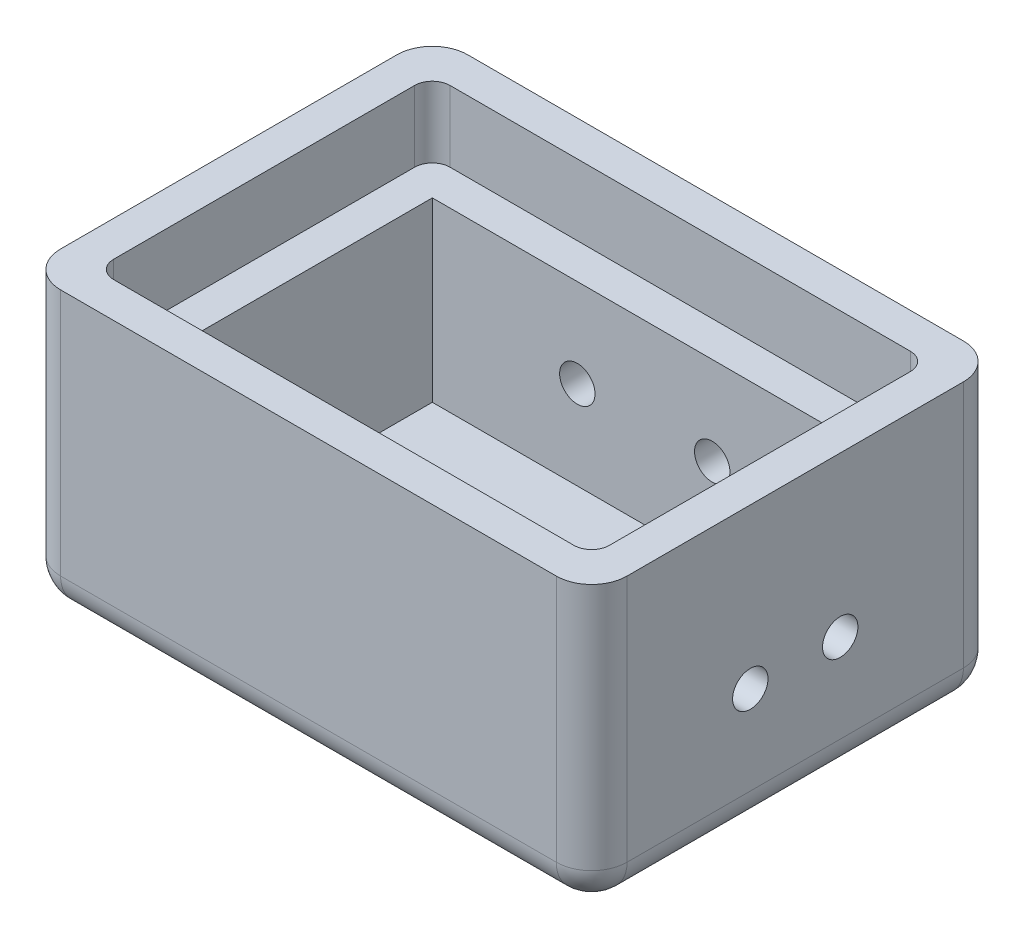
ISO-10303-21;
HEADER;
FILE_DESCRIPTION(('STEP AP214'),'2;1');
FILE_NAME('part.step','',(''),(''),'','','');
FILE_SCHEMA(('AUTOMOTIVE_DESIGN { 1 0 10303 214 1 1 1 1 }'));
ENDSEC;
DATA;
#1=APPLICATION_CONTEXT('core data for automotive mechanical design processes');
#2=APPLICATION_PROTOCOL_DEFINITION('international standard','automotive_design',2000,#1);
#3=PRODUCT_CONTEXT('',#1,'mechanical');
#4=PRODUCT('Part','Part','',(#3));
#5=PRODUCT_RELATED_PRODUCT_CATEGORY('part','',(#4));
#6=PRODUCT_DEFINITION_FORMATION('','',#4);
#7=PRODUCT_DEFINITION_CONTEXT('part definition',#1,'design');
#8=PRODUCT_DEFINITION('design','',#6,#7);
#9=PRODUCT_DEFINITION_SHAPE('','',#8);
#10=(LENGTH_UNIT() NAMED_UNIT(*) SI_UNIT(.MILLI.,.METRE.));
#11=(NAMED_UNIT(*) PLANE_ANGLE_UNIT() SI_UNIT($,.RADIAN.));
#12=(NAMED_UNIT(*) SI_UNIT($,.STERADIAN.) SOLID_ANGLE_UNIT());
#13=UNCERTAINTY_MEASURE_WITH_UNIT(LENGTH_MEASURE(1.E-05),#10,'distance_accuracy_value','');
#14=(GEOMETRIC_REPRESENTATION_CONTEXT(3) GLOBAL_UNCERTAINTY_ASSIGNED_CONTEXT((#13)) GLOBAL_UNIT_ASSIGNED_CONTEXT((#10,
#11,#12)) REPRESENTATION_CONTEXT('',''));
#15=CARTESIAN_POINT('',(0.,0.,0.));
#16=DIRECTION('',(0.,0.,1.));
#17=DIRECTION('',(1.,0.,0.));
#18=AXIS2_PLACEMENT_3D('',#15,#16,#17);
#19=CARTESIAN_POINT('',(0.,6.,0.));
#20=DIRECTION('',(0.,-1.,0.));
#21=DIRECTION('',(0.,0.,-1.));
#22=AXIS2_PLACEMENT_3D('',#19,#20,#21);
#23=PLANE('',#22);
#24=DIRECTION('',(1.,0.,0.));
#25=VECTOR('',#24,1.);
#26=CARTESIAN_POINT('',(-7.,6.,4.75000000000001));
#27=LINE('',#26,#25);
#28=CARTESIAN_POINT('',(-6.5,6.,4.75000000000001));
#29=VERTEX_POINT('',#28);
#30=CARTESIAN_POINT('',(6.49999999999999,6.,4.75000000000001));
#31=VERTEX_POINT('',#30);
#32=EDGE_CURVE('E235',#29,#31,#27,.T.);
#33=ORIENTED_EDGE('',*,*,#32,.T.);
#34=CARTESIAN_POINT('',(6.49999999999999,6.,4.25000000000001));
#35=DIRECTION('',(0.,-1.,0.));
#36=DIRECTION('',(0.,0.,-1.));
#37=AXIS2_PLACEMENT_3D('',#34,#35,#36);
#38=CIRCLE('',#37,0.5);
#39=CARTESIAN_POINT('',(6.99999999999999,6.,4.25000000000001));
#40=VERTEX_POINT('',#39);
#41=EDGE_CURVE('E352',#31,#40,#38,.F.);
#42=ORIENTED_EDGE('',*,*,#41,.T.);
#43=DIRECTION('',(0.,0.,-1.));
#44=VECTOR('',#43,1.);
#45=CARTESIAN_POINT('',(6.99999999999999,6.,4.75000000000001));
#46=LINE('',#45,#44);
#47=CARTESIAN_POINT('',(6.99999999999999,6.,-4.25000000000001));
#48=VERTEX_POINT('',#47);
#49=EDGE_CURVE('E225',#40,#48,#46,.T.);
#50=ORIENTED_EDGE('',*,*,#49,.T.);
#51=CARTESIAN_POINT('',(6.49999999999999,6.,-4.25000000000001));
#52=DIRECTION('',(0.,-1.,0.));
#53=DIRECTION('',(0.,0.,-1.));
#54=AXIS2_PLACEMENT_3D('',#51,#52,#53);
#55=CIRCLE('',#54,0.5);
#56=CARTESIAN_POINT('',(6.49999999999999,6.,-4.75000000000001));
#57=VERTEX_POINT('',#56);
#58=EDGE_CURVE('E350',#48,#57,#55,.F.);
#59=ORIENTED_EDGE('',*,*,#58,.T.);
#60=DIRECTION('',(-1.,0.,0.));
#61=VECTOR('',#60,1.);
#62=CARTESIAN_POINT('',(-7.,6.,-4.75000000000001));
#63=LINE('',#62,#61);
#64=CARTESIAN_POINT('',(-6.5,6.,-4.75000000000001));
#65=VERTEX_POINT('',#64);
#66=EDGE_CURVE('E228',#57,#65,#63,.T.);
#67=ORIENTED_EDGE('',*,*,#66,.T.);
#68=CARTESIAN_POINT('',(-6.5,6.,-4.25000000000001));
#69=DIRECTION('',(0.,-1.,0.));
#70=DIRECTION('',(0.,0.,-1.));
#71=AXIS2_PLACEMENT_3D('',#68,#69,#70);
#72=CIRCLE('',#71,0.5);
#73=CARTESIAN_POINT('',(-7.,6.,-4.25000000000001));
#74=VERTEX_POINT('',#73);
#75=EDGE_CURVE('E348',#65,#74,#72,.F.);
#76=ORIENTED_EDGE('',*,*,#75,.T.);
#77=DIRECTION('',(0.,0.,1.));
#78=VECTOR('',#77,1.);
#79=CARTESIAN_POINT('',(-7.,6.,4.75000000000001));
#80=LINE('',#79,#78);
#81=CARTESIAN_POINT('',(-7.,6.,4.25000000000001));
#82=VERTEX_POINT('',#81);
#83=EDGE_CURVE('E232',#74,#82,#80,.T.);
#84=ORIENTED_EDGE('',*,*,#83,.T.);
#85=CARTESIAN_POINT('',(-6.5,6.,4.25000000000001));
#86=DIRECTION('',(0.,-1.,0.));
#87=DIRECTION('',(0.,0.,-1.));
#88=AXIS2_PLACEMENT_3D('',#85,#86,#87);
#89=CIRCLE('',#88,0.5);
#90=EDGE_CURVE('E346',#82,#29,#89,.F.);
#91=ORIENTED_EDGE('',*,*,#90,.T.);
#92=EDGE_LOOP('',(#33,#42,#50,#59,#67,#76,#84,#91));
#93=FACE_BOUND('',#92,.T.);
#94=DIRECTION('',(0.,0.,-1.));
#95=VECTOR('',#94,1.);
#96=CARTESIAN_POINT('',(5.99999999999999,6.,3.75));
#97=LINE('',#96,#95);
#98=CARTESIAN_POINT('',(5.99999999999999,6.,3.75));
#99=VERTEX_POINT('',#98);
#100=CARTESIAN_POINT('',(5.99999999999999,6.,-3.75));
#101=VERTEX_POINT('',#100);
#102=EDGE_CURVE('E214',#99,#101,#97,.T.);
#103=ORIENTED_EDGE('',*,*,#102,.F.);
#104=DIRECTION('',(1.,0.,0.));
#105=VECTOR('',#104,1.);
#106=CARTESIAN_POINT('',(-5.99999999999999,6.,3.75));
#107=LINE('',#106,#105);
#108=CARTESIAN_POINT('',(-5.99999999999999,6.,3.75));
#109=VERTEX_POINT('',#108);
#110=EDGE_CURVE('E207',#109,#99,#107,.T.);
#111=ORIENTED_EDGE('',*,*,#110,.F.);
#112=DIRECTION('',(0.,0.,1.));
#113=VECTOR('',#112,1.);
#114=CARTESIAN_POINT('',(-5.99999999999999,6.,3.75));
#115=LINE('',#114,#113);
#116=CARTESIAN_POINT('',(-5.99999999999999,6.,-3.75));
#117=VERTEX_POINT('',#116);
#118=EDGE_CURVE('E210',#117,#109,#115,.T.);
#119=ORIENTED_EDGE('',*,*,#118,.F.);
#120=DIRECTION('',(-1.,0.,0.));
#121=VECTOR('',#120,1.);
#122=CARTESIAN_POINT('',(-5.99999999999999,6.,-3.75));
#123=LINE('',#122,#121);
#124=EDGE_CURVE('E201',#101,#117,#123,.T.);
#125=ORIENTED_EDGE('',*,*,#124,.F.);
#126=EDGE_LOOP('',(#103,#111,#119,#125));
#127=FACE_BOUND('',#126,.T.);
#128=ADVANCED_FACE('F37',(#93,#127),#23,.F.);
#129=CARTESIAN_POINT('',(-8.,8.,5.75000000000001));
#130=DIRECTION('',(-1.,0.,0.));
#131=DIRECTION('',(0.,0.,1.));
#132=AXIS2_PLACEMENT_3D('',#129,#130,#131);
#133=PLANE('',#132);
#134=DIRECTION('',(0.,0.,-1.));
#135=VECTOR('',#134,1.);
#136=CARTESIAN_POINT('',(-8.,8.,5.75000000000001));
#137=LINE('',#136,#135);
#138=CARTESIAN_POINT('',(-8.,8.,4.75000000000001));
#139=VERTEX_POINT('',#138);
#140=CARTESIAN_POINT('',(-8.,8.,-4.75));
#141=VERTEX_POINT('',#140);
#142=EDGE_CURVE('E238',#139,#141,#137,.T.);
#143=ORIENTED_EDGE('',*,*,#142,.T.);
#144=DIRECTION('',(0.,-1.,0.));
#145=VECTOR('',#144,1.);
#146=CARTESIAN_POINT('',(-8.,8.,-4.75));
#147=LINE('',#146,#145);
#148=CARTESIAN_POINT('',(-8.,1.,-4.75));
#149=VERTEX_POINT('',#148);
#150=EDGE_CURVE('E299',#141,#149,#147,.T.);
#151=ORIENTED_EDGE('',*,*,#150,.T.);
#152=DIRECTION('',(0.,0.,-1.));
#153=VECTOR('',#152,1.);
#154=CARTESIAN_POINT('',(-8.,1.,5.75000000000001));
#155=LINE('',#154,#153);
#156=CARTESIAN_POINT('',(-8.,1.,4.75000000000001));
#157=VERTEX_POINT('',#156);
#158=EDGE_CURVE('E297',#149,#157,#155,.F.);
#159=ORIENTED_EDGE('',*,*,#158,.T.);
#160=DIRECTION('',(0.,-1.,0.));
#161=VECTOR('',#160,1.);
#162=CARTESIAN_POINT('',(-8.,8.,4.75000000000001));
#163=LINE('',#162,#161);
#164=EDGE_CURVE('E295',#157,#139,#163,.F.);
#165=ORIENTED_EDGE('',*,*,#164,.T.);
#166=EDGE_LOOP('',(#143,#151,#159,#165));
#167=FACE_BOUND('',#166,.T.);
#168=ADVANCED_FACE('F409',(#167),#133,.T.);
#169=CARTESIAN_POINT('',(-8.,8.,5.75000000000001));
#170=DIRECTION('',(0.,0.,-1.));
#171=DIRECTION('',(-1.,0.,0.));
#172=AXIS2_PLACEMENT_3D('',#169,#170,#171);
#173=PLANE('',#172);
#174=DIRECTION('',(1.,0.,0.));
#175=VECTOR('',#174,1.);
#176=CARTESIAN_POINT('',(8.,1.,5.75000000000001));
#177=LINE('',#176,#175);
#178=CARTESIAN_POINT('',(-7.,1.,5.75000000000001));
#179=VERTEX_POINT('',#178);
#180=CARTESIAN_POINT('',(7.,1.,5.75000000000001));
#181=VERTEX_POINT('',#180);
#182=EDGE_CURVE('E291',#179,#181,#177,.T.);
#183=ORIENTED_EDGE('',*,*,#182,.T.);
#184=DIRECTION('',(0.,-1.,0.));
#185=VECTOR('',#184,1.);
#186=CARTESIAN_POINT('',(7.,8.,5.75000000000001));
#187=LINE('',#186,#185);
#188=CARTESIAN_POINT('',(7.,8.,5.75000000000001));
#189=VERTEX_POINT('',#188);
#190=EDGE_CURVE('E293',#181,#189,#187,.F.);
#191=ORIENTED_EDGE('',*,*,#190,.T.);
#192=DIRECTION('',(1.,0.,0.));
#193=VECTOR('',#192,1.);
#194=CARTESIAN_POINT('',(-8.,8.,5.75000000000001));
#195=LINE('',#194,#193);
#196=CARTESIAN_POINT('',(-7.,8.,5.75000000000001));
#197=VERTEX_POINT('',#196);
#198=EDGE_CURVE('E256',#197,#189,#195,.T.);
#199=ORIENTED_EDGE('',*,*,#198,.F.);
#200=DIRECTION('',(0.,-1.,0.));
#201=VECTOR('',#200,1.);
#202=CARTESIAN_POINT('',(-7.,0.,5.75000000000001));
#203=LINE('',#202,#201);
#204=EDGE_CURVE('E289',#197,#179,#203,.T.);
#205=ORIENTED_EDGE('',*,*,#204,.T.);
#206=EDGE_LOOP('',(#183,#191,#199,#205));
#207=FACE_BOUND('',#206,.T.);
#208=ADVANCED_FACE('F414',(#207),#173,.F.);
#209=CARTESIAN_POINT('',(8.,8.,5.75000000000001));
#210=DIRECTION('',(-1.,0.,0.));
#211=DIRECTION('',(0.,0.,1.));
#212=AXIS2_PLACEMENT_3D('',#209,#210,#211);
#213=PLANE('',#212);
#214=CARTESIAN_POINT('',(8.,3.5,-1.27));
#215=DIRECTION('',(-1.,0.,0.));
#216=DIRECTION('',(0.,0.,1.));
#217=AXIS2_PLACEMENT_3D('',#214,#215,#216);
#218=CIRCLE('',#217,0.5);
#219=CARTESIAN_POINT('',(8.,3.5,-0.77));
#220=VERTEX_POINT('',#219);
#221=EDGE_CURVE('E305',#220,#220,#218,.F.);
#222=ORIENTED_EDGE('',*,*,#221,.F.);
#223=EDGE_LOOP('',(#222));
#224=FACE_BOUND('',#223,.T.);
#225=CARTESIAN_POINT('',(8.,3.5,1.27));
#226=DIRECTION('',(-1.,0.,0.));
#227=DIRECTION('',(0.,0.,1.));
#228=AXIS2_PLACEMENT_3D('',#225,#226,#227);
#229=CIRCLE('',#228,0.5);
#230=CARTESIAN_POINT('',(8.,3.5,1.77));
#231=VERTEX_POINT('',#230);
#232=EDGE_CURVE('E573',#231,#231,#229,.F.);
#233=ORIENTED_EDGE('',*,*,#232,.F.);
#234=EDGE_LOOP('',(#233));
#235=FACE_BOUND('',#234,.T.);
#236=DIRECTION('',(0.,0.,-1.));
#237=VECTOR('',#236,1.);
#238=CARTESIAN_POINT('',(8.,1.,-5.75000000000001));
#239=LINE('',#238,#237);
#240=CARTESIAN_POINT('',(8.,1.,4.75000000000001));
#241=VERTEX_POINT('',#240);
#242=CARTESIAN_POINT('',(8.,1.,-4.75000000000001));
#243=VERTEX_POINT('',#242);
#244=EDGE_CURVE('E268',#241,#243,#239,.T.);
#245=ORIENTED_EDGE('',*,*,#244,.T.);
#246=DIRECTION('',(0.,-1.,0.));
#247=VECTOR('',#246,1.);
#248=CARTESIAN_POINT('',(8.,8.,-4.75000000000001));
#249=LINE('',#248,#247);
#250=CARTESIAN_POINT('',(8.,8.,-4.75));
#251=VERTEX_POINT('',#250);
#252=EDGE_CURVE('E270',#243,#251,#249,.F.);
#253=ORIENTED_EDGE('',*,*,#252,.T.);
#254=DIRECTION('',(0.,0.,-1.));
#255=VECTOR('',#254,1.);
#256=CARTESIAN_POINT('',(8.,8.,5.75000000000001));
#257=LINE('',#256,#255);
#258=CARTESIAN_POINT('',(8.,8.,4.75000000000001));
#259=VERTEX_POINT('',#258);
#260=EDGE_CURVE('E253',#259,#251,#257,.T.);
#261=ORIENTED_EDGE('',*,*,#260,.F.);
#262=DIRECTION('',(0.,-1.,0.));
#263=VECTOR('',#262,1.);
#264=CARTESIAN_POINT('',(8.,8.,4.75000000000001));
#265=LINE('',#264,#263);
#266=EDGE_CURVE('E266',#259,#241,#265,.T.);
#267=ORIENTED_EDGE('',*,*,#266,.T.);
#268=EDGE_LOOP('',(#245,#253,#261,#267));
#269=FACE_BOUND('',#268,.T.);
#270=ADVANCED_FACE('F437',(#224,#235,#269),#213,.F.);
#271=CARTESIAN_POINT('',(-8.,8.,-5.75000000000001));
#272=DIRECTION('',(0.,0.,-1.));
#273=DIRECTION('',(-1.,0.,0.));
#274=AXIS2_PLACEMENT_3D('',#271,#272,#273);
#275=PLANE('',#274);
#276=CARTESIAN_POINT('',(1.905,3.5,-5.75000000000001));
#277=DIRECTION('',(0.,0.,-1.));
#278=DIRECTION('',(-1.,0.,0.));
#279=AXIS2_PLACEMENT_3D('',#276,#277,#278);
#280=CIRCLE('',#279,0.5);
#281=CARTESIAN_POINT('',(1.405,3.5,-5.75000000000001));
#282=VERTEX_POINT('',#281);
#283=EDGE_CURVE('E561',#282,#282,#280,.F.);
#284=ORIENTED_EDGE('',*,*,#283,.T.);
#285=EDGE_LOOP('',(#284));
#286=FACE_BOUND('',#285,.T.);
#287=CARTESIAN_POINT('',(-1.905,3.5,-5.75000000000001));
#288=DIRECTION('',(0.,0.,-1.));
#289=DIRECTION('',(-1.,0.,0.));
#290=AXIS2_PLACEMENT_3D('',#287,#288,#289);
#291=CIRCLE('',#290,0.5);
#292=CARTESIAN_POINT('',(-2.405,3.5,-5.75000000000001));
#293=VERTEX_POINT('',#292);
#294=EDGE_CURVE('E562',#293,#293,#291,.F.);
#295=ORIENTED_EDGE('',*,*,#294,.T.);
#296=EDGE_LOOP('',(#295));
#297=FACE_BOUND('',#296,.T.);
#298=DIRECTION('',(1.,0.,0.));
#299=VECTOR('',#298,1.);
#300=CARTESIAN_POINT('',(-8.,8.,-5.75000000000001));
#301=LINE('',#300,#299);
#302=CARTESIAN_POINT('',(-7.,8.,-5.75000000000001));
#303=VERTEX_POINT('',#302);
#304=CARTESIAN_POINT('',(7.,8.,-5.75000000000001));
#305=VERTEX_POINT('',#304);
#306=EDGE_CURVE('E250',#303,#305,#301,.T.);
#307=ORIENTED_EDGE('',*,*,#306,.T.);
#308=DIRECTION('',(0.,-1.,0.));
#309=VECTOR('',#308,1.);
#310=CARTESIAN_POINT('',(7.,0.,-5.75000000000001));
#311=LINE('',#310,#309);
#312=CARTESIAN_POINT('',(7.,1.,-5.75000000000001));
#313=VERTEX_POINT('',#312);
#314=EDGE_CURVE('E263',#305,#313,#311,.T.);
#315=ORIENTED_EDGE('',*,*,#314,.T.);
#316=DIRECTION('',(1.,0.,0.));
#317=VECTOR('',#316,1.);
#318=CARTESIAN_POINT('',(-8.,1.,-5.75000000000001));
#319=LINE('',#318,#317);
#320=CARTESIAN_POINT('',(-7.,1.,-5.75000000000001));
#321=VERTEX_POINT('',#320);
#322=EDGE_CURVE('E261',#313,#321,#319,.F.);
#323=ORIENTED_EDGE('',*,*,#322,.T.);
#324=DIRECTION('',(0.,-1.,0.));
#325=VECTOR('',#324,1.);
#326=CARTESIAN_POINT('',(-7.,8.,-5.75000000000001));
#327=LINE('',#326,#325);
#328=EDGE_CURVE('E259',#321,#303,#327,.F.);
#329=ORIENTED_EDGE('',*,*,#328,.T.);
#330=EDGE_LOOP('',(#307,#315,#323,#329));
#331=FACE_BOUND('',#330,.T.);
#332=ADVANCED_FACE('F431',(#286,#297,#331),#275,.T.);
#333=CARTESIAN_POINT('',(0.,8.,0.));
#334=DIRECTION('',(0.,-1.,0.));
#335=DIRECTION('',(0.,0.,-1.));
#336=AXIS2_PLACEMENT_3D('',#333,#334,#335);
#337=PLANE('',#336);
#338=DIRECTION('',(-1.,0.,0.));
#339=VECTOR('',#338,1.);
#340=CARTESIAN_POINT('',(-7.,8.,-4.75000000000001));
#341=LINE('',#340,#339);
#342=CARTESIAN_POINT('',(6.49999999999999,8.,-4.75000000000001));
#343=VERTEX_POINT('',#342);
#344=CARTESIAN_POINT('',(-6.5,8.,-4.75000000000001));
#345=VERTEX_POINT('',#344);
#346=EDGE_CURVE('E241',#343,#345,#341,.T.);
#347=ORIENTED_EDGE('',*,*,#346,.F.);
#348=CARTESIAN_POINT('',(6.49999999999999,8.,-4.25000000000001));
#349=DIRECTION('',(0.,-1.,0.));
#350=DIRECTION('',(0.,0.,-1.));
#351=AXIS2_PLACEMENT_3D('',#348,#349,#350);
#352=CIRCLE('',#351,0.5);
#353=CARTESIAN_POINT('',(6.99999999999999,8.,-4.25000000000001));
#354=VERTEX_POINT('',#353);
#355=EDGE_CURVE('E365',#343,#354,#352,.T.);
#356=ORIENTED_EDGE('',*,*,#355,.T.);
#357=DIRECTION('',(0.,0.,-1.));
#358=VECTOR('',#357,1.);
#359=CARTESIAN_POINT('',(6.99999999999999,8.,4.75000000000001));
#360=LINE('',#359,#358);
#361=CARTESIAN_POINT('',(6.99999999999999,8.,4.25000000000001));
#362=VERTEX_POINT('',#361);
#363=EDGE_CURVE('E224',#362,#354,#360,.T.);
#364=ORIENTED_EDGE('',*,*,#363,.F.);
#365=CARTESIAN_POINT('',(6.49999999999999,8.,4.25000000000001));
#366=DIRECTION('',(0.,-1.,0.));
#367=DIRECTION('',(0.,0.,-1.));
#368=AXIS2_PLACEMENT_3D('',#365,#366,#367);
#369=CIRCLE('',#368,0.5);
#370=CARTESIAN_POINT('',(6.49999999999999,8.,4.75000000000001));
#371=VERTEX_POINT('',#370);
#372=EDGE_CURVE('E363',#362,#371,#369,.T.);
#373=ORIENTED_EDGE('',*,*,#372,.T.);
#374=DIRECTION('',(1.,0.,0.));
#375=VECTOR('',#374,1.);
#376=CARTESIAN_POINT('',(-7.,8.,4.75000000000001));
#377=LINE('',#376,#375);
#378=CARTESIAN_POINT('',(-6.5,8.,4.75000000000001));
#379=VERTEX_POINT('',#378);
#380=EDGE_CURVE('E229',#379,#371,#377,.T.);
#381=ORIENTED_EDGE('',*,*,#380,.F.);
#382=CARTESIAN_POINT('',(-6.5,8.,4.25000000000001));
#383=DIRECTION('',(0.,-1.,0.));
#384=DIRECTION('',(0.,0.,-1.));
#385=AXIS2_PLACEMENT_3D('',#382,#383,#384);
#386=CIRCLE('',#385,0.5);
#387=CARTESIAN_POINT('',(-7.,8.,4.25000000000001));
#388=VERTEX_POINT('',#387);
#389=EDGE_CURVE('E12',#379,#388,#386,.T.);
#390=ORIENTED_EDGE('',*,*,#389,.T.);
#391=DIRECTION('',(0.,0.,1.));
#392=VECTOR('',#391,1.);
#393=CARTESIAN_POINT('',(-7.,8.,4.75000000000001));
#394=LINE('',#393,#392);
#395=CARTESIAN_POINT('',(-7.,8.,-4.25000000000001));
#396=VERTEX_POINT('',#395);
#397=EDGE_CURVE('E244',#396,#388,#394,.T.);
#398=ORIENTED_EDGE('',*,*,#397,.F.);
#399=CARTESIAN_POINT('',(-6.5,8.,-4.25000000000001));
#400=DIRECTION('',(0.,-1.,0.));
#401=DIRECTION('',(0.,0.,-1.));
#402=AXIS2_PLACEMENT_3D('',#399,#400,#401);
#403=CIRCLE('',#402,0.5);
#404=EDGE_CURVE('E45',#396,#345,#403,.T.);
#405=ORIENTED_EDGE('',*,*,#404,.T.);
#406=EDGE_LOOP('',(#347,#356,#364,#373,#381,#390,#398,#405));
#407=FACE_BOUND('',#406,.T.);
#408=ORIENTED_EDGE('',*,*,#260,.T.);
#409=CARTESIAN_POINT('',(7.,8.,-4.75000000000001));
#410=DIRECTION('',(0.,-1.,0.));
#411=DIRECTION('',(0.,0.,-1.));
#412=AXIS2_PLACEMENT_3D('',#409,#410,#411);
#413=CIRCLE('',#412,1.);
#414=EDGE_CURVE('E278',#251,#305,#413,.F.);
#415=ORIENTED_EDGE('',*,*,#414,.T.);
#416=ORIENTED_EDGE('',*,*,#306,.F.);
#417=CARTESIAN_POINT('',(-7.,8.,-4.75));
#418=DIRECTION('',(0.,-1.,0.));
#419=DIRECTION('',(0.,0.,-1.));
#420=AXIS2_PLACEMENT_3D('',#417,#418,#419);
#421=CIRCLE('',#420,1.);
#422=EDGE_CURVE('E274',#303,#141,#421,.F.);
#423=ORIENTED_EDGE('',*,*,#422,.T.);
#424=ORIENTED_EDGE('',*,*,#142,.F.);
#425=CARTESIAN_POINT('',(-7.,8.,4.75000000000001));
#426=DIRECTION('',(0.,-1.,0.));
#427=DIRECTION('',(0.,0.,-1.));
#428=AXIS2_PLACEMENT_3D('',#425,#426,#427);
#429=CIRCLE('',#428,1.);
#430=EDGE_CURVE('E272',#139,#197,#429,.F.);
#431=ORIENTED_EDGE('',*,*,#430,.T.);
#432=ORIENTED_EDGE('',*,*,#198,.T.);
#433=CARTESIAN_POINT('',(7.,8.,4.75000000000001));
#434=DIRECTION('',(0.,-1.,0.));
#435=DIRECTION('',(0.,0.,-1.));
#436=AXIS2_PLACEMENT_3D('',#433,#434,#435);
#437=CIRCLE('',#436,1.);
#438=EDGE_CURVE('E276',#189,#259,#437,.F.);
#439=ORIENTED_EDGE('',*,*,#438,.T.);
#440=EDGE_LOOP('',(#408,#415,#416,#423,#424,#431,#432,#439));
#441=FACE_BOUND('',#440,.T.);
#442=ADVANCED_FACE('F367',(#407,#441),#337,.F.);
#443=CARTESIAN_POINT('',(0.,0.,0.));
#444=DIRECTION('',(0.,-1.,0.));
#445=DIRECTION('',(0.,0.,-1.));
#446=AXIS2_PLACEMENT_3D('',#443,#444,#445);
#447=PLANE('',#446);
#448=DIRECTION('',(1.,0.,0.));
#449=VECTOR('',#448,1.);
#450=CARTESIAN_POINT('',(0.,0.,-4.75000000000001));
#451=LINE('',#450,#449);
#452=CARTESIAN_POINT('',(-7.,0.,-4.75000000000001));
#453=VERTEX_POINT('',#452);
#454=CARTESIAN_POINT('',(7.,0.,-4.75000000000001));
#455=VERTEX_POINT('',#454);
#456=EDGE_CURVE('E280',#453,#455,#451,.T.);
#457=ORIENTED_EDGE('',*,*,#456,.T.);
#458=DIRECTION('',(0.,0.,-1.));
#459=VECTOR('',#458,1.);
#460=CARTESIAN_POINT('',(7.,0.,5.75000000000001));
#461=LINE('',#460,#459);
#462=CARTESIAN_POINT('',(7.,0.,4.75000000000001));
#463=VERTEX_POINT('',#462);
#464=EDGE_CURVE('E286',#455,#463,#461,.F.);
#465=ORIENTED_EDGE('',*,*,#464,.T.);
#466=DIRECTION('',(1.,0.,0.));
#467=VECTOR('',#466,1.);
#468=CARTESIAN_POINT('',(-8.,0.,4.75000000000001));
#469=LINE('',#468,#467);
#470=CARTESIAN_POINT('',(-7.,0.,4.75000000000001));
#471=VERTEX_POINT('',#470);
#472=EDGE_CURVE('E284',#463,#471,#469,.F.);
#473=ORIENTED_EDGE('',*,*,#472,.T.);
#474=DIRECTION('',(0.,0.,-1.));
#475=VECTOR('',#474,1.);
#476=CARTESIAN_POINT('',(-7.,0.,0.));
#477=LINE('',#476,#475);
#478=EDGE_CURVE('E282',#471,#453,#477,.T.);
#479=ORIENTED_EDGE('',*,*,#478,.T.);
#480=EDGE_LOOP('',(#457,#465,#473,#479));
#481=FACE_BOUND('',#480,.T.);
#482=ADVANCED_FACE('F428',(#481),#447,.T.);
#483=CARTESIAN_POINT('',(6.99999999999999,6.,4.75000000000001));
#484=DIRECTION('',(1.,0.,0.));
#485=DIRECTION('',(0.,0.,-1.));
#486=AXIS2_PLACEMENT_3D('',#483,#484,#485);
#487=PLANE('',#486);
#488=ORIENTED_EDGE('',*,*,#49,.F.);
#489=DIRECTION('',(0.,1.,0.));
#490=VECTOR('',#489,1.);
#491=CARTESIAN_POINT('',(6.99999999999999,8.,4.25000000000001));
#492=LINE('',#491,#490);
#493=EDGE_CURVE('E338',#40,#362,#492,.T.);
#494=ORIENTED_EDGE('',*,*,#493,.T.);
#495=ORIENTED_EDGE('',*,*,#363,.T.);
#496=DIRECTION('',(0.,1.,0.));
#497=VECTOR('',#496,1.);
#498=CARTESIAN_POINT('',(6.99999999999999,6.,-4.25000000000001));
#499=LINE('',#498,#497);
#500=EDGE_CURVE('E301',#354,#48,#499,.F.);
#501=ORIENTED_EDGE('',*,*,#500,.T.);
#502=EDGE_LOOP('',(#488,#494,#495,#501));
#503=FACE_BOUND('',#502,.T.);
#504=ADVANCED_FACE('F395',(#503),#487,.F.);
#505=CARTESIAN_POINT('',(-7.,6.,4.75000000000001));
#506=DIRECTION('',(0.,0.,1.));
#507=DIRECTION('',(1.,0.,0.));
#508=AXIS2_PLACEMENT_3D('',#505,#506,#507);
#509=PLANE('',#508);
#510=ORIENTED_EDGE('',*,*,#380,.T.);
#511=DIRECTION('',(0.,1.,0.));
#512=VECTOR('',#511,1.);
#513=CARTESIAN_POINT('',(6.49999999999999,6.,4.75000000000001));
#514=LINE('',#513,#512);
#515=EDGE_CURVE('E344',#371,#31,#514,.F.);
#516=ORIENTED_EDGE('',*,*,#515,.T.);
#517=ORIENTED_EDGE('',*,*,#32,.F.);
#518=DIRECTION('',(0.,1.,0.));
#519=VECTOR('',#518,1.);
#520=CARTESIAN_POINT('',(-6.5,8.,4.75000000000001));
#521=LINE('',#520,#519);
#522=EDGE_CURVE('E341',#29,#379,#521,.T.);
#523=ORIENTED_EDGE('',*,*,#522,.T.);
#524=EDGE_LOOP('',(#510,#516,#517,#523));
#525=FACE_BOUND('',#524,.T.);
#526=ADVANCED_FACE('F387',(#525),#509,.F.);
#527=CARTESIAN_POINT('',(-7.,6.,4.75000000000001));
#528=DIRECTION('',(-1.,0.,0.));
#529=DIRECTION('',(0.,0.,1.));
#530=AXIS2_PLACEMENT_3D('',#527,#528,#529);
#531=PLANE('',#530);
#532=ORIENTED_EDGE('',*,*,#83,.F.);
#533=DIRECTION('',(0.,1.,0.));
#534=VECTOR('',#533,1.);
#535=CARTESIAN_POINT('',(-7.,8.,-4.25000000000001));
#536=LINE('',#535,#534);
#537=EDGE_CURVE('E361',#74,#396,#536,.T.);
#538=ORIENTED_EDGE('',*,*,#537,.T.);
#539=ORIENTED_EDGE('',*,*,#397,.T.);
#540=DIRECTION('',(0.,1.,0.));
#541=VECTOR('',#540,1.);
#542=CARTESIAN_POINT('',(-7.,6.,4.25000000000001));
#543=LINE('',#542,#541);
#544=EDGE_CURVE('E359',#388,#82,#543,.F.);
#545=ORIENTED_EDGE('',*,*,#544,.T.);
#546=EDGE_LOOP('',(#532,#538,#539,#545));
#547=FACE_BOUND('',#546,.T.);
#548=ADVANCED_FACE('F380',(#547),#531,.F.);
#549=CARTESIAN_POINT('',(-7.,6.,-4.75000000000001));
#550=DIRECTION('',(0.,0.,-1.));
#551=DIRECTION('',(-1.,0.,0.));
#552=AXIS2_PLACEMENT_3D('',#549,#550,#551);
#553=PLANE('',#552);
#554=ORIENTED_EDGE('',*,*,#66,.F.);
#555=DIRECTION('',(0.,1.,0.));
#556=VECTOR('',#555,1.);
#557=CARTESIAN_POINT('',(6.49999999999999,8.,-4.75000000000001));
#558=LINE('',#557,#556);
#559=EDGE_CURVE('E356',#57,#343,#558,.T.);
#560=ORIENTED_EDGE('',*,*,#559,.T.);
#561=ORIENTED_EDGE('',*,*,#346,.T.);
#562=DIRECTION('',(0.,1.,0.));
#563=VECTOR('',#562,1.);
#564=CARTESIAN_POINT('',(-6.5,6.,-4.75000000000001));
#565=LINE('',#564,#563);
#566=EDGE_CURVE('E354',#345,#65,#565,.F.);
#567=ORIENTED_EDGE('',*,*,#566,.T.);
#568=EDGE_LOOP('',(#554,#560,#561,#567));
#569=FACE_BOUND('',#568,.T.);
#570=ADVANCED_FACE('F371',(#569),#553,.F.);
#571=CARTESIAN_POINT('',(0.,1.,0.));
#572=DIRECTION('',(0.,-1.,0.));
#573=DIRECTION('',(0.,0.,-1.));
#574=AXIS2_PLACEMENT_3D('',#571,#572,#573);
#575=PLANE('',#574);
#576=DIRECTION('',(0.,0.,-1.));
#577=VECTOR('',#576,1.);
#578=CARTESIAN_POINT('',(5.99999999999999,0.999999999999999,3.75));
#579=LINE('',#578,#577);
#580=CARTESIAN_POINT('',(5.99999999999999,0.999999999999999,3.75));
#581=VERTEX_POINT('',#580);
#582=CARTESIAN_POINT('',(5.99999999999999,0.999999999999999,-3.75));
#583=VERTEX_POINT('',#582);
#584=EDGE_CURVE('E205',#581,#583,#579,.T.);
#585=ORIENTED_EDGE('',*,*,#584,.T.);
#586=DIRECTION('',(-1.,0.,0.));
#587=VECTOR('',#586,1.);
#588=CARTESIAN_POINT('',(-5.99999999999999,0.999999999999999,-3.75));
#589=LINE('',#588,#587);
#590=CARTESIAN_POINT('',(-5.99999999999999,0.999999999999999,-3.75));
#591=VERTEX_POINT('',#590);
#592=EDGE_CURVE('E198',#583,#591,#589,.T.);
#593=ORIENTED_EDGE('',*,*,#592,.T.);
#594=DIRECTION('',(0.,0.,1.));
#595=VECTOR('',#594,1.);
#596=CARTESIAN_POINT('',(-5.99999999999999,0.999999999999999,3.75));
#597=LINE('',#596,#595);
#598=CARTESIAN_POINT('',(-5.99999999999999,0.999999999999999,3.75));
#599=VERTEX_POINT('',#598);
#600=EDGE_CURVE('E185',#591,#599,#597,.T.);
#601=ORIENTED_EDGE('',*,*,#600,.T.);
#602=DIRECTION('',(1.,0.,0.));
#603=VECTOR('',#602,1.);
#604=CARTESIAN_POINT('',(-5.99999999999999,0.999999999999999,3.75));
#605=LINE('',#604,#603);
#606=EDGE_CURVE('E219',#599,#581,#605,.T.);
#607=ORIENTED_EDGE('',*,*,#606,.T.);
#608=EDGE_LOOP('',(#585,#593,#601,#607));
#609=FACE_BOUND('',#608,.T.);
#610=ADVANCED_FACE('F204',(#609),#575,.F.);
#611=CARTESIAN_POINT('',(-5.99999999999999,-14.1509716980849,-3.75));
#612=DIRECTION('',(0.,0.,-1.));
#613=DIRECTION('',(-1.,0.,0.));
#614=AXIS2_PLACEMENT_3D('',#611,#612,#613);
#615=PLANE('',#614);
#616=CARTESIAN_POINT('',(1.905,3.5,-3.75));
#617=DIRECTION('',(0.,0.,1.));
#618=DIRECTION('',(1.,0.,0.));
#619=AXIS2_PLACEMENT_3D('',#616,#617,#618);
#620=CIRCLE('',#619,0.5);
#621=CARTESIAN_POINT('',(2.405,3.5,-3.75));
#622=VERTEX_POINT('',#621);
#623=EDGE_CURVE('E556',#622,#622,#620,.T.);
#624=ORIENTED_EDGE('',*,*,#623,.F.);
#625=EDGE_LOOP('',(#624));
#626=FACE_BOUND('',#625,.T.);
#627=CARTESIAN_POINT('',(-1.905,3.5,-3.75));
#628=DIRECTION('',(0.,0.,1.));
#629=DIRECTION('',(1.,0.,0.));
#630=AXIS2_PLACEMENT_3D('',#627,#628,#629);
#631=CIRCLE('',#630,0.5);
#632=CARTESIAN_POINT('',(-1.405,3.5,-3.75));
#633=VERTEX_POINT('',#632);
#634=EDGE_CURVE('E559',#633,#633,#631,.T.);
#635=ORIENTED_EDGE('',*,*,#634,.F.);
#636=EDGE_LOOP('',(#635));
#637=FACE_BOUND('',#636,.T.);
#638=DIRECTION('',(0.,1.,0.));
#639=VECTOR('',#638,1.);
#640=CARTESIAN_POINT('',(5.99999999999999,-14.1509716980849,-3.75));
#641=LINE('',#640,#639);
#642=EDGE_CURVE('E217',#583,#101,#641,.T.);
#643=ORIENTED_EDGE('',*,*,#642,.T.);
#644=ORIENTED_EDGE('',*,*,#124,.T.);
#645=DIRECTION('',(0.,1.,0.));
#646=VECTOR('',#645,1.);
#647=CARTESIAN_POINT('',(-5.99999999999999,-14.1509716980849,-3.75));
#648=LINE('',#647,#646);
#649=EDGE_CURVE('E188',#591,#117,#648,.T.);
#650=ORIENTED_EDGE('',*,*,#649,.F.);
#651=ORIENTED_EDGE('',*,*,#592,.F.);
#652=EDGE_LOOP('',(#643,#644,#650,#651));
#653=FACE_BOUND('',#652,.T.);
#654=ADVANCED_FACE('F197',(#626,#637,#653),#615,.F.);
#655=CARTESIAN_POINT('',(-5.99999999999999,-14.1509716980849,3.75));
#656=DIRECTION('',(-1.,0.,0.));
#657=DIRECTION('',(0.,0.,1.));
#658=AXIS2_PLACEMENT_3D('',#655,#656,#657);
#659=PLANE('',#658);
#660=ORIENTED_EDGE('',*,*,#649,.T.);
#661=ORIENTED_EDGE('',*,*,#118,.T.);
#662=DIRECTION('',(0.,1.,0.));
#663=VECTOR('',#662,1.);
#664=CARTESIAN_POINT('',(-5.99999999999999,-14.1509716980849,3.75));
#665=LINE('',#664,#663);
#666=EDGE_CURVE('E191',#599,#109,#665,.T.);
#667=ORIENTED_EDGE('',*,*,#666,.F.);
#668=ORIENTED_EDGE('',*,*,#600,.F.);
#669=EDGE_LOOP('',(#660,#661,#667,#668));
#670=FACE_BOUND('',#669,.T.);
#671=ADVANCED_FACE('F187',(#670),#659,.F.);
#672=CARTESIAN_POINT('',(-5.99999999999999,-14.1509716980849,3.75));
#673=DIRECTION('',(0.,0.,1.));
#674=DIRECTION('',(1.,0.,0.));
#675=AXIS2_PLACEMENT_3D('',#672,#673,#674);
#676=PLANE('',#675);
#677=ORIENTED_EDGE('',*,*,#666,.T.);
#678=ORIENTED_EDGE('',*,*,#110,.T.);
#679=DIRECTION('',(0.,1.,0.));
#680=VECTOR('',#679,1.);
#681=CARTESIAN_POINT('',(5.99999999999999,-14.1509716980849,3.75));
#682=LINE('',#681,#680);
#683=EDGE_CURVE('E218',#581,#99,#682,.T.);
#684=ORIENTED_EDGE('',*,*,#683,.F.);
#685=ORIENTED_EDGE('',*,*,#606,.F.);
#686=EDGE_LOOP('',(#677,#678,#684,#685));
#687=FACE_BOUND('',#686,.T.);
#688=ADVANCED_FACE('F495',(#687),#676,.F.);
#689=CARTESIAN_POINT('',(5.99999999999999,-14.1509716980849,3.75));
#690=DIRECTION('',(1.,0.,0.));
#691=DIRECTION('',(0.,0.,-1.));
#692=AXIS2_PLACEMENT_3D('',#689,#690,#691);
#693=PLANE('',#692);
#694=CARTESIAN_POINT('',(5.99999999999999,3.5,-1.27));
#695=DIRECTION('',(-1.,0.,0.));
#696=DIRECTION('',(0.,0.,1.));
#697=AXIS2_PLACEMENT_3D('',#694,#695,#696);
#698=CIRCLE('',#697,0.5);
#699=CARTESIAN_POINT('',(5.99999999999999,3.5,-0.77));
#700=VERTEX_POINT('',#699);
#701=EDGE_CURVE('E570',#700,#700,#698,.T.);
#702=ORIENTED_EDGE('',*,*,#701,.F.);
#703=EDGE_LOOP('',(#702));
#704=FACE_BOUND('',#703,.T.);
#705=CARTESIAN_POINT('',(5.99999999999999,3.5,1.27));
#706=DIRECTION('',(-1.,0.,0.));
#707=DIRECTION('',(0.,0.,1.));
#708=AXIS2_PLACEMENT_3D('',#705,#706,#707);
#709=CIRCLE('',#708,0.5);
#710=CARTESIAN_POINT('',(5.99999999999999,3.5,1.77));
#711=VERTEX_POINT('',#710);
#712=EDGE_CURVE('E576',#711,#711,#709,.T.);
#713=ORIENTED_EDGE('',*,*,#712,.F.);
#714=EDGE_LOOP('',(#713));
#715=FACE_BOUND('',#714,.T.);
#716=ORIENTED_EDGE('',*,*,#683,.T.);
#717=ORIENTED_EDGE('',*,*,#102,.T.);
#718=ORIENTED_EDGE('',*,*,#642,.F.);
#719=ORIENTED_EDGE('',*,*,#584,.F.);
#720=EDGE_LOOP('',(#716,#717,#718,#719));
#721=FACE_BOUND('',#720,.T.);
#722=ADVANCED_FACE('F490',(#704,#715,#721),#693,.F.);
#723=CARTESIAN_POINT('',(-7.,8.,4.75000000000001));
#724=DIRECTION('',(0.,1.,0.));
#725=DIRECTION('',(0.,0.,1.));
#726=AXIS2_PLACEMENT_3D('',#723,#724,#725);
#727=CYLINDRICAL_SURFACE('',#726,1.);
#728=CARTESIAN_POINT('',(-7.,1.,4.75000000000001));
#729=DIRECTION('',(0.,-1.,0.));
#730=DIRECTION('',(0.,0.,-1.));
#731=AXIS2_PLACEMENT_3D('',#728,#729,#730);
#732=CIRCLE('',#731,1.);
#733=EDGE_CURVE('E334',#179,#157,#732,.T.);
#734=ORIENTED_EDGE('',*,*,#733,.F.);
#735=ORIENTED_EDGE('',*,*,#204,.F.);
#736=ORIENTED_EDGE('',*,*,#430,.F.);
#737=ORIENTED_EDGE('',*,*,#164,.F.);
#738=EDGE_LOOP('',(#734,#735,#736,#737));
#739=FACE_BOUND('',#738,.T.);
#740=ADVANCED_FACE('F487',(#739),#727,.T.);
#741=CARTESIAN_POINT('',(-7.,1.,4.75000000000001));
#742=DIRECTION('',(0.,0.,1.));
#743=DIRECTION('',(1.,0.,0.));
#744=AXIS2_PLACEMENT_3D('',#741,#742,#743);
#745=SPHERICAL_SURFACE('',#744,1.);
#746=CARTESIAN_POINT('',(-7.,1.,4.75000000000001));
#747=DIRECTION('',(-1.,0.,0.));
#748=DIRECTION('',(0.,0.,1.));
#749=AXIS2_PLACEMENT_3D('',#746,#747,#748);
#750=CIRCLE('',#749,1.);
#751=EDGE_CURVE('E328',#179,#471,#750,.F.);
#752=ORIENTED_EDGE('',*,*,#751,.F.);
#753=ORIENTED_EDGE('',*,*,#733,.T.);
#754=CARTESIAN_POINT('',(-7.,1.,4.75000000000001));
#755=DIRECTION('',(0.,0.,1.));
#756=DIRECTION('',(1.,0.,0.));
#757=AXIS2_PLACEMENT_3D('',#754,#755,#756);
#758=CIRCLE('',#757,1.);
#759=EDGE_CURVE('E331',#471,#157,#758,.F.);
#760=ORIENTED_EDGE('',*,*,#759,.F.);
#761=EDGE_LOOP('',(#752,#753,#760));
#762=FACE_BOUND('',#761,.T.);
#763=ADVANCED_FACE('F483',(#762),#745,.T.);
#764=CARTESIAN_POINT('',(-7.,8.,-4.75));
#765=DIRECTION('',(0.,-1.,0.));
#766=DIRECTION('',(0.,0.,-1.));
#767=AXIS2_PLACEMENT_3D('',#764,#765,#766);
#768=CYLINDRICAL_SURFACE('',#767,1.);
#769=ORIENTED_EDGE('',*,*,#422,.F.);
#770=ORIENTED_EDGE('',*,*,#328,.F.);
#771=CARTESIAN_POINT('',(-7.,1.,-4.75));
#772=DIRECTION('',(0.,-1.,0.));
#773=DIRECTION('',(0.,0.,-1.));
#774=AXIS2_PLACEMENT_3D('',#771,#772,#773);
#775=CIRCLE('',#774,1.);
#776=EDGE_CURVE('E325',#149,#321,#775,.T.);
#777=ORIENTED_EDGE('',*,*,#776,.F.);
#778=ORIENTED_EDGE('',*,*,#150,.F.);
#779=EDGE_LOOP('',(#769,#770,#777,#778));
#780=FACE_BOUND('',#779,.T.);
#781=ADVANCED_FACE('F479',(#780),#768,.T.);
#782=CARTESIAN_POINT('',(-7.,1.,0.));
#783=DIRECTION('',(0.,0.,-1.));
#784=DIRECTION('',(-1.,0.,0.));
#785=AXIS2_PLACEMENT_3D('',#782,#783,#784);
#786=CYLINDRICAL_SURFACE('',#785,1.);
#787=ORIENTED_EDGE('',*,*,#759,.T.);
#788=ORIENTED_EDGE('',*,*,#158,.F.);
#789=CARTESIAN_POINT('',(-7.,1.,-4.75000000000001));
#790=DIRECTION('',(0.,0.,-1.));
#791=DIRECTION('',(-1.,0.,0.));
#792=AXIS2_PLACEMENT_3D('',#789,#790,#791);
#793=CIRCLE('',#792,1.);
#794=EDGE_CURVE('E322',#453,#149,#793,.T.);
#795=ORIENTED_EDGE('',*,*,#794,.F.);
#796=ORIENTED_EDGE('',*,*,#478,.F.);
#797=EDGE_LOOP('',(#787,#788,#795,#796));
#798=FACE_BOUND('',#797,.T.);
#799=ADVANCED_FACE('F475',(#798),#786,.T.);
#800=CARTESIAN_POINT('',(-8.,1.,4.75000000000001));
#801=DIRECTION('',(-1.,0.,0.));
#802=DIRECTION('',(0.,0.,1.));
#803=AXIS2_PLACEMENT_3D('',#800,#801,#802);
#804=CYLINDRICAL_SURFACE('',#803,1.);
#805=ORIENTED_EDGE('',*,*,#751,.T.);
#806=ORIENTED_EDGE('',*,*,#472,.F.);
#807=CARTESIAN_POINT('',(7.,1.,4.75000000000001));
#808=DIRECTION('',(1.,0.,0.));
#809=DIRECTION('',(0.,0.,-1.));
#810=AXIS2_PLACEMENT_3D('',#807,#808,#809);
#811=CIRCLE('',#810,1.);
#812=EDGE_CURVE('E319',#181,#463,#811,.T.);
#813=ORIENTED_EDGE('',*,*,#812,.F.);
#814=ORIENTED_EDGE('',*,*,#182,.F.);
#815=EDGE_LOOP('',(#805,#806,#813,#814));
#816=FACE_BOUND('',#815,.T.);
#817=ADVANCED_FACE('F471',(#816),#804,.T.);
#818=CARTESIAN_POINT('',(7.,8.,4.75000000000001));
#819=DIRECTION('',(0.,-1.,0.));
#820=DIRECTION('',(0.,0.,-1.));
#821=AXIS2_PLACEMENT_3D('',#818,#819,#820);
#822=CYLINDRICAL_SURFACE('',#821,1.);
#823=ORIENTED_EDGE('',*,*,#438,.F.);
#824=ORIENTED_EDGE('',*,*,#190,.F.);
#825=CARTESIAN_POINT('',(7.,1.,4.75000000000001));
#826=DIRECTION('',(0.,-1.,0.));
#827=DIRECTION('',(0.,0.,-1.));
#828=AXIS2_PLACEMENT_3D('',#825,#826,#827);
#829=CIRCLE('',#828,1.);
#830=EDGE_CURVE('E316',#241,#181,#829,.T.);
#831=ORIENTED_EDGE('',*,*,#830,.F.);
#832=ORIENTED_EDGE('',*,*,#266,.F.);
#833=EDGE_LOOP('',(#823,#824,#831,#832));
#834=FACE_BOUND('',#833,.T.);
#835=ADVANCED_FACE('F467',(#834),#822,.T.);
#836=CARTESIAN_POINT('',(-7.,1.,-4.75000000000001));
#837=DIRECTION('',(0.,0.,1.));
#838=DIRECTION('',(1.,0.,0.));
#839=AXIS2_PLACEMENT_3D('',#836,#837,#838);
#840=SPHERICAL_SURFACE('',#839,1.);
#841=ORIENTED_EDGE('',*,*,#794,.T.);
#842=ORIENTED_EDGE('',*,*,#776,.T.);
#843=CARTESIAN_POINT('',(-7.,1.,-4.75000000000001));
#844=DIRECTION('',(-1.,0.,0.));
#845=DIRECTION('',(0.,0.,1.));
#846=AXIS2_PLACEMENT_3D('',#843,#844,#845);
#847=CIRCLE('',#846,1.);
#848=EDGE_CURVE('E313',#453,#321,#847,.F.);
#849=ORIENTED_EDGE('',*,*,#848,.F.);
#850=EDGE_LOOP('',(#841,#842,#849));
#851=FACE_BOUND('',#850,.T.);
#852=ADVANCED_FACE('F463',(#851),#840,.T.);
#853=CARTESIAN_POINT('',(7.,1.,4.75000000000001));
#854=DIRECTION('',(0.,0.,1.));
#855=DIRECTION('',(1.,0.,0.));
#856=AXIS2_PLACEMENT_3D('',#853,#854,#855);
#857=SPHERICAL_SURFACE('',#856,1.);
#858=ORIENTED_EDGE('',*,*,#830,.T.);
#859=ORIENTED_EDGE('',*,*,#812,.T.);
#860=CARTESIAN_POINT('',(7.,1.,4.75000000000001));
#861=DIRECTION('',(0.,0.,1.));
#862=DIRECTION('',(1.,0.,0.));
#863=AXIS2_PLACEMENT_3D('',#860,#861,#862);
#864=CIRCLE('',#863,1.);
#865=EDGE_CURVE('E311',#241,#463,#864,.F.);
#866=ORIENTED_EDGE('',*,*,#865,.F.);
#867=EDGE_LOOP('',(#858,#859,#866));
#868=FACE_BOUND('',#867,.T.);
#869=ADVANCED_FACE('F459',(#868),#857,.T.);
#870=CARTESIAN_POINT('',(0.,1.,-4.75000000000001));
#871=DIRECTION('',(1.,0.,0.));
#872=DIRECTION('',(0.,0.,-1.));
#873=AXIS2_PLACEMENT_3D('',#870,#871,#872);
#874=CYLINDRICAL_SURFACE('',#873,1.);
#875=ORIENTED_EDGE('',*,*,#848,.T.);
#876=ORIENTED_EDGE('',*,*,#322,.F.);
#877=CARTESIAN_POINT('',(7.,1.,-4.75000000000001));
#878=DIRECTION('',(1.,0.,0.));
#879=DIRECTION('',(0.,0.,-1.));
#880=AXIS2_PLACEMENT_3D('',#877,#878,#879);
#881=CIRCLE('',#880,1.);
#882=EDGE_CURVE('E308',#455,#313,#881,.T.);
#883=ORIENTED_EDGE('',*,*,#882,.F.);
#884=ORIENTED_EDGE('',*,*,#456,.F.);
#885=EDGE_LOOP('',(#875,#876,#883,#884));
#886=FACE_BOUND('',#885,.T.);
#887=ADVANCED_FACE('F455',(#886),#874,.T.);
#888=CARTESIAN_POINT('',(7.,1.,5.75000000000001));
#889=DIRECTION('',(0.,0.,1.));
#890=DIRECTION('',(1.,0.,0.));
#891=AXIS2_PLACEMENT_3D('',#888,#889,#890);
#892=CYLINDRICAL_SURFACE('',#891,1.);
#893=ORIENTED_EDGE('',*,*,#865,.T.);
#894=ORIENTED_EDGE('',*,*,#464,.F.);
#895=CARTESIAN_POINT('',(7.,1.,-4.75000000000001));
#896=DIRECTION('',(0.,0.,-1.));
#897=DIRECTION('',(-1.,0.,0.));
#898=AXIS2_PLACEMENT_3D('',#895,#896,#897);
#899=CIRCLE('',#898,1.);
#900=EDGE_CURVE('E304',#243,#455,#899,.T.);
#901=ORIENTED_EDGE('',*,*,#900,.F.);
#902=ORIENTED_EDGE('',*,*,#244,.F.);
#903=EDGE_LOOP('',(#893,#894,#901,#902));
#904=FACE_BOUND('',#903,.T.);
#905=ADVANCED_FACE('F451',(#904),#892,.T.);
#906=CARTESIAN_POINT('',(7.,1.,-4.75000000000001));
#907=DIRECTION('',(0.,0.,1.));
#908=DIRECTION('',(1.,0.,0.));
#909=AXIS2_PLACEMENT_3D('',#906,#907,#908);
#910=SPHERICAL_SURFACE('',#909,1.);
#911=ORIENTED_EDGE('',*,*,#900,.T.);
#912=ORIENTED_EDGE('',*,*,#882,.T.);
#913=CARTESIAN_POINT('',(7.,1.,-4.75000000000001));
#914=DIRECTION('',(0.,-1.,0.));
#915=DIRECTION('',(0.,0.,-1.));
#916=AXIS2_PLACEMENT_3D('',#913,#914,#915);
#917=CIRCLE('',#916,1.);
#918=EDGE_CURVE('E302',#243,#313,#917,.F.);
#919=ORIENTED_EDGE('',*,*,#918,.F.);
#920=EDGE_LOOP('',(#911,#912,#919));
#921=FACE_BOUND('',#920,.T.);
#922=ADVANCED_FACE('F447',(#921),#910,.T.);
#923=CARTESIAN_POINT('',(7.,8.,-4.75000000000001));
#924=DIRECTION('',(0.,1.,0.));
#925=DIRECTION('',(0.,0.,1.));
#926=AXIS2_PLACEMENT_3D('',#923,#924,#925);
#927=CYLINDRICAL_SURFACE('',#926,1.);
#928=ORIENTED_EDGE('',*,*,#414,.F.);
#929=ORIENTED_EDGE('',*,*,#252,.F.);
#930=ORIENTED_EDGE('',*,*,#918,.T.);
#931=ORIENTED_EDGE('',*,*,#314,.F.);
#932=EDGE_LOOP('',(#928,#929,#930,#931));
#933=FACE_BOUND('',#932,.T.);
#934=ADVANCED_FACE('F406',(#933),#927,.T.);
#935=CARTESIAN_POINT('',(6.49999999999999,6.,4.25000000000001));
#936=DIRECTION('',(0.,-1.,0.));
#937=DIRECTION('',(0.,0.,-1.));
#938=AXIS2_PLACEMENT_3D('',#935,#936,#937);
#939=CYLINDRICAL_SURFACE('',#938,0.5);
#940=ORIENTED_EDGE('',*,*,#41,.F.);
#941=ORIENTED_EDGE('',*,*,#515,.F.);
#942=ORIENTED_EDGE('',*,*,#372,.F.);
#943=ORIENTED_EDGE('',*,*,#493,.F.);
#944=EDGE_LOOP('',(#940,#941,#942,#943));
#945=FACE_BOUND('',#944,.T.);
#946=ADVANCED_FACE('F390',(#945),#939,.F.);
#947=CARTESIAN_POINT('',(6.49999999999999,6.,-4.25000000000001));
#948=DIRECTION('',(0.,-1.,0.));
#949=DIRECTION('',(0.,0.,-1.));
#950=AXIS2_PLACEMENT_3D('',#947,#948,#949);
#951=CYLINDRICAL_SURFACE('',#950,0.5);
#952=ORIENTED_EDGE('',*,*,#58,.F.);
#953=ORIENTED_EDGE('',*,*,#500,.F.);
#954=ORIENTED_EDGE('',*,*,#355,.F.);
#955=ORIENTED_EDGE('',*,*,#559,.F.);
#956=EDGE_LOOP('',(#952,#953,#954,#955));
#957=FACE_BOUND('',#956,.T.);
#958=ADVANCED_FACE('F399',(#957),#951,.F.);
#959=CARTESIAN_POINT('',(-6.5,6.,-4.25000000000001));
#960=DIRECTION('',(0.,-1.,0.));
#961=DIRECTION('',(0.,0.,-1.));
#962=AXIS2_PLACEMENT_3D('',#959,#960,#961);
#963=CYLINDRICAL_SURFACE('',#962,0.5);
#964=ORIENTED_EDGE('',*,*,#75,.F.);
#965=ORIENTED_EDGE('',*,*,#566,.F.);
#966=ORIENTED_EDGE('',*,*,#404,.F.);
#967=ORIENTED_EDGE('',*,*,#537,.F.);
#968=EDGE_LOOP('',(#964,#965,#966,#967));
#969=FACE_BOUND('',#968,.T.);
#970=ADVANCED_FACE('F374',(#969),#963,.F.);
#971=CARTESIAN_POINT('',(-6.5,6.,4.25000000000001));
#972=DIRECTION('',(0.,-1.,0.));
#973=DIRECTION('',(0.,0.,-1.));
#974=AXIS2_PLACEMENT_3D('',#971,#972,#973);
#975=CYLINDRICAL_SURFACE('',#974,0.5);
#976=ORIENTED_EDGE('',*,*,#90,.F.);
#977=ORIENTED_EDGE('',*,*,#544,.F.);
#978=ORIENTED_EDGE('',*,*,#389,.F.);
#979=ORIENTED_EDGE('',*,*,#522,.F.);
#980=EDGE_LOOP('',(#976,#977,#978,#979));
#981=FACE_BOUND('',#980,.T.);
#982=ADVANCED_FACE('F39',(#981),#975,.F.);
#983=CARTESIAN_POINT('',(8.001,3.5,1.27));
#984=DIRECTION('',(-1.,0.,0.));
#985=DIRECTION('',(0.,0.,1.));
#986=AXIS2_PLACEMENT_3D('',#983,#984,#985);
#987=CYLINDRICAL_SURFACE('',#986,0.5);
#988=ORIENTED_EDGE('',*,*,#712,.T.);
#989=EDGE_LOOP('',(#988));
#990=FACE_BOUND('',#989,.T.);
#991=ORIENTED_EDGE('',*,*,#232,.T.);
#992=EDGE_LOOP('',(#991));
#993=FACE_BOUND('',#992,.T.);
#994=ADVANCED_FACE('F544',(#990,#993),#987,.F.);
#995=CARTESIAN_POINT('',(8.001,3.5,-1.27));
#996=DIRECTION('',(-1.,0.,0.));
#997=DIRECTION('',(0.,0.,1.));
#998=AXIS2_PLACEMENT_3D('',#995,#996,#997);
#999=CYLINDRICAL_SURFACE('',#998,0.5);
#1000=ORIENTED_EDGE('',*,*,#701,.T.);
#1001=EDGE_LOOP('',(#1000));
#1002=FACE_BOUND('',#1001,.T.);
#1003=ORIENTED_EDGE('',*,*,#221,.T.);
#1004=EDGE_LOOP('',(#1003));
#1005=FACE_BOUND('',#1004,.T.);
#1006=ADVANCED_FACE('F590',(#1002,#1005),#999,.F.);
#1007=CARTESIAN_POINT('',(-1.905,3.5,-5.75100000000001));
#1008=DIRECTION('',(0.,0.,1.));
#1009=DIRECTION('',(1.,0.,0.));
#1010=AXIS2_PLACEMENT_3D('',#1007,#1008,#1009);
#1011=CYLINDRICAL_SURFACE('',#1010,0.5);
#1012=ORIENTED_EDGE('',*,*,#294,.F.);
#1013=EDGE_LOOP('',(#1012));
#1014=FACE_BOUND('',#1013,.T.);
#1015=ORIENTED_EDGE('',*,*,#634,.T.);
#1016=EDGE_LOOP('',(#1015));
#1017=FACE_BOUND('',#1016,.T.);
#1018=ADVANCED_FACE('F596',(#1014,#1017),#1011,.F.);
#1019=CARTESIAN_POINT('',(1.905,3.5,-5.75100000000001));
#1020=DIRECTION('',(0.,0.,1.));
#1021=DIRECTION('',(1.,0.,0.));
#1022=AXIS2_PLACEMENT_3D('',#1019,#1020,#1021);
#1023=CYLINDRICAL_SURFACE('',#1022,0.5);
#1024=ORIENTED_EDGE('',*,*,#283,.F.);
#1025=EDGE_LOOP('',(#1024));
#1026=FACE_BOUND('',#1025,.T.);
#1027=ORIENTED_EDGE('',*,*,#623,.T.);
#1028=EDGE_LOOP('',(#1027));
#1029=FACE_BOUND('',#1028,.T.);
#1030=ADVANCED_FACE('F790',(#1026,#1029),#1023,.F.);
#1031=CLOSED_SHELL('',(#128,#168,#208,#270,#332,#442,#482,#504,#526,#548,#570,#610,#654,#671,
#688,#722,#740,#763,#781,#799,#817,#835,#852,#869,#887,#905,#922,#934,#946,#958,#970,#982,#994,
#1006,#1018,#1030));
#1032=MANIFOLD_SOLID_BREP('B2',#1031);
#1033=ADVANCED_BREP_SHAPE_REPRESENTATION('',(#18,#1032),#14);
#1034=SHAPE_DEFINITION_REPRESENTATION(#9,#1033);
ENDSEC;
END-ISO-10303-21;
